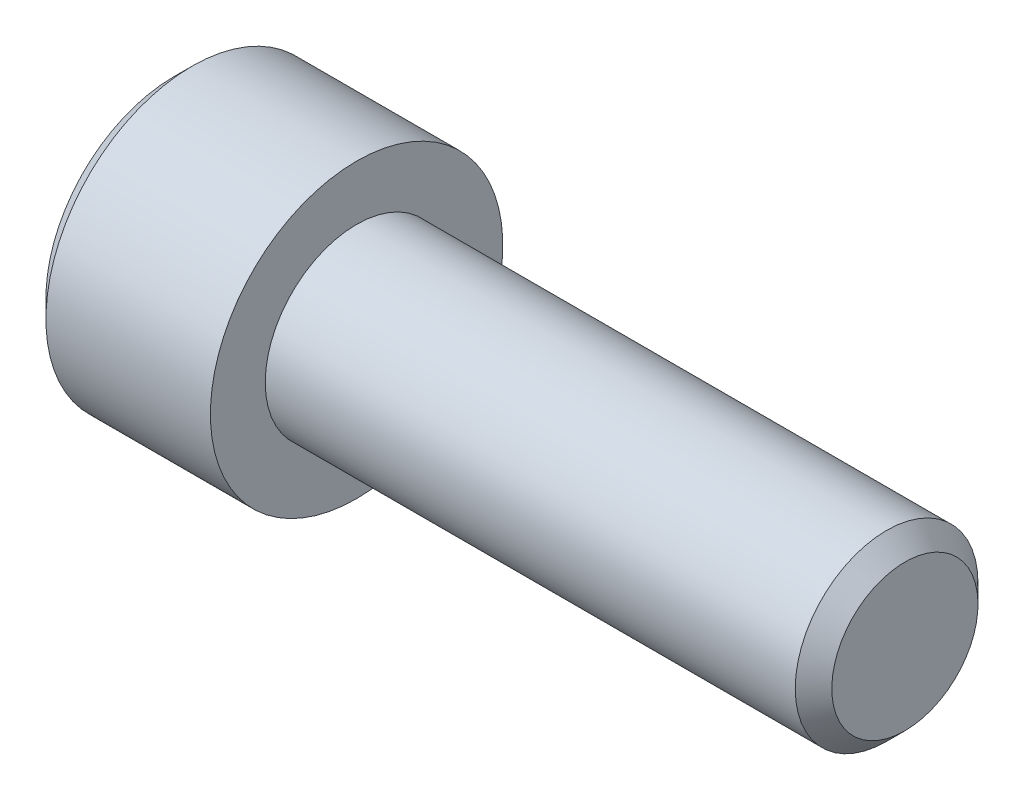
ISO-10303-21;
HEADER;
FILE_DESCRIPTION(('STEP AP214'),'2;1');
FILE_NAME('part.step','',(''),(''),'','','');
FILE_SCHEMA(('AUTOMOTIVE_DESIGN { 1 0 10303 214 1 1 1 1 }'));
ENDSEC;
DATA;
#1=APPLICATION_CONTEXT('core data for automotive mechanical design processes');
#2=APPLICATION_PROTOCOL_DEFINITION('international standard','automotive_design',2000,#1);
#3=PRODUCT_CONTEXT('',#1,'mechanical');
#4=PRODUCT('Part','Part','',(#3));
#5=PRODUCT_RELATED_PRODUCT_CATEGORY('part','',(#4));
#6=PRODUCT_DEFINITION_FORMATION('','',#4);
#7=PRODUCT_DEFINITION_CONTEXT('part definition',#1,'design');
#8=PRODUCT_DEFINITION('design','',#6,#7);
#9=PRODUCT_DEFINITION_SHAPE('','',#8);
#10=(LENGTH_UNIT() NAMED_UNIT(*) SI_UNIT(.MILLI.,.METRE.));
#11=(NAMED_UNIT(*) PLANE_ANGLE_UNIT() SI_UNIT($,.RADIAN.));
#12=(NAMED_UNIT(*) SI_UNIT($,.STERADIAN.) SOLID_ANGLE_UNIT());
#13=UNCERTAINTY_MEASURE_WITH_UNIT(LENGTH_MEASURE(1.E-05),#10,'distance_accuracy_value','');
#14=(GEOMETRIC_REPRESENTATION_CONTEXT(3) GLOBAL_UNCERTAINTY_ASSIGNED_CONTEXT((#13)) GLOBAL_UNIT_ASSIGNED_CONTEXT((#10,
#11,#12)) REPRESENTATION_CONTEXT('',''));
#15=CARTESIAN_POINT('',(0.,0.,0.));
#16=DIRECTION('',(0.,0.,1.));
#17=DIRECTION('',(1.,0.,0.));
#18=AXIS2_PLACEMENT_3D('',#15,#16,#17);
#19=CARTESIAN_POINT('',(-10.,0.,0.));
#20=DIRECTION('',(1.,0.,0.));
#21=DIRECTION('',(0.,1.,0.));
#22=AXIS2_PLACEMENT_3D('',#19,#20,#21);
#23=PLANE('',#22);
#24=CARTESIAN_POINT('',(-10.,0.,0.));
#25=DIRECTION('',(1.,0.,0.));
#26=DIRECTION('',(0.,1.,0.));
#27=AXIS2_PLACEMENT_3D('',#24,#25,#26);
#28=CIRCLE('',#27,6.99999999999999);
#29=CARTESIAN_POINT('',(-10.,6.99999999999999,0.));
#30=VERTEX_POINT('',#29);
#31=EDGE_CURVE('E42',#30,#30,#28,.F.);
#32=ORIENTED_EDGE('',*,*,#31,.T.);
#33=EDGE_LOOP('',(#32));
#34=FACE_BOUND('',#33,.T.);
#35=DIRECTION('',(0.,0.5,0.866025403784439));
#36=VECTOR('',#35,1.);
#37=CARTESIAN_POINT('',(-10.,2.30940107675851,-4.));
#38=LINE('',#37,#36);
#39=CARTESIAN_POINT('',(-10.,2.30940107675851,-4.));
#40=VERTEX_POINT('',#39);
#41=CARTESIAN_POINT('',(-10.,4.61880215351701,0.));
#42=VERTEX_POINT('',#41);
#43=EDGE_CURVE('E49',#40,#42,#38,.T.);
#44=ORIENTED_EDGE('',*,*,#43,.T.);
#45=DIRECTION('',(0.,-0.5,0.866025403784438));
#46=VECTOR('',#45,1.);
#47=CARTESIAN_POINT('',(-10.,4.61880215351701,0.));
#48=LINE('',#47,#46);
#49=CARTESIAN_POINT('',(-10.,2.3094010767585,4.));
#50=VERTEX_POINT('',#49);
#51=EDGE_CURVE('E107',#42,#50,#48,.T.);
#52=ORIENTED_EDGE('',*,*,#51,.T.);
#53=DIRECTION('',(0.,-1.,0.));
#54=VECTOR('',#53,1.);
#55=CARTESIAN_POINT('',(-10.,2.3094010767585,4.));
#56=LINE('',#55,#54);
#57=CARTESIAN_POINT('',(-10.,-2.3094010767585,4.));
#58=VERTEX_POINT('',#57);
#59=EDGE_CURVE('E291',#50,#58,#56,.T.);
#60=ORIENTED_EDGE('',*,*,#59,.T.);
#61=DIRECTION('',(0.,-0.5,-0.866025403784439));
#62=VECTOR('',#61,1.);
#63=CARTESIAN_POINT('',(-10.,-2.3094010767585,4.));
#64=LINE('',#63,#62);
#65=CARTESIAN_POINT('',(-10.,-4.61880215351701,0.));
#66=VERTEX_POINT('',#65);
#67=EDGE_CURVE('E288',#58,#66,#64,.T.);
#68=ORIENTED_EDGE('',*,*,#67,.T.);
#69=DIRECTION('',(0.,0.5,-0.866025403784439));
#70=VECTOR('',#69,1.);
#71=CARTESIAN_POINT('',(-10.,-4.61880215351701,0.));
#72=LINE('',#71,#70);
#73=CARTESIAN_POINT('',(-10.,-2.3094010767585,-4.));
#74=VERTEX_POINT('',#73);
#75=EDGE_CURVE('E282',#66,#74,#72,.T.);
#76=ORIENTED_EDGE('',*,*,#75,.T.);
#77=DIRECTION('',(0.,1.,0.));
#78=VECTOR('',#77,1.);
#79=CARTESIAN_POINT('',(-10.,-2.3094010767585,-4.));
#80=LINE('',#79,#78);
#81=EDGE_CURVE('E103',#74,#40,#80,.T.);
#82=ORIENTED_EDGE('',*,*,#81,.T.);
#83=EDGE_LOOP('',(#44,#52,#60,#68,#76,#82));
#84=FACE_BOUND('',#83,.T.);
#85=ADVANCED_FACE('F34',(#34,#84),#23,.F.);
#86=CARTESIAN_POINT('',(30.,0.,0.));
#87=DIRECTION('',(-1.,0.,0.));
#88=DIRECTION('',(0.,-1.,0.));
#89=AXIS2_PLACEMENT_3D('',#86,#87,#88);
#90=CYLINDRICAL_SURFACE('',#89,8.);
#91=CARTESIAN_POINT('',(-8.99999999999998,0.,0.));
#92=DIRECTION('',(1.,0.,0.));
#93=DIRECTION('',(0.,1.,0.));
#94=AXIS2_PLACEMENT_3D('',#91,#92,#93);
#95=CIRCLE('',#94,8.);
#96=CARTESIAN_POINT('',(-8.99999999999998,7.99999999999999,0.));
#97=VERTEX_POINT('',#96);
#98=EDGE_CURVE('E11',#97,#97,#95,.T.);
#99=ORIENTED_EDGE('',*,*,#98,.T.);
#100=EDGE_LOOP('',(#99));
#101=FACE_BOUND('',#100,.T.);
#102=CARTESIAN_POINT('',(0.,0.,0.));
#103=DIRECTION('',(-1.,0.,0.));
#104=DIRECTION('',(0.,-1.,0.));
#105=AXIS2_PLACEMENT_3D('',#102,#103,#104);
#106=CIRCLE('',#105,8.);
#107=CARTESIAN_POINT('',(0.,-8.,0.));
#108=VERTEX_POINT('',#107);
#109=EDGE_CURVE('E120',#108,#108,#106,.T.);
#110=ORIENTED_EDGE('',*,*,#109,.T.);
#111=EDGE_LOOP('',(#110));
#112=FACE_BOUND('',#111,.T.);
#113=ADVANCED_FACE('F143',(#101,#112),#90,.T.);
#114=CARTESIAN_POINT('',(0.,7.99999999999999,0.));
#115=DIRECTION('',(-1.,0.,0.));
#116=DIRECTION('',(0.,-1.,0.));
#117=AXIS2_PLACEMENT_3D('',#114,#115,#116);
#118=PLANE('',#117);
#119=ORIENTED_EDGE('',*,*,#109,.F.);
#120=EDGE_LOOP('',(#119));
#121=FACE_BOUND('',#120,.T.);
#122=CARTESIAN_POINT('',(0.,0.,0.));
#123=DIRECTION('',(-1.,0.,0.));
#124=DIRECTION('',(0.,-1.,0.));
#125=AXIS2_PLACEMENT_3D('',#122,#123,#124);
#126=CIRCLE('',#125,5.);
#127=CARTESIAN_POINT('',(0.,-5.,0.));
#128=VERTEX_POINT('',#127);
#129=EDGE_CURVE('E112',#128,#128,#126,.T.);
#130=ORIENTED_EDGE('',*,*,#129,.T.);
#131=EDGE_LOOP('',(#130));
#132=FACE_BOUND('',#131,.T.);
#133=ADVANCED_FACE('F148',(#121,#132),#118,.F.);
#134=CARTESIAN_POINT('',(30.,0.,0.));
#135=DIRECTION('',(-1.,0.,0.));
#136=DIRECTION('',(0.,-1.,0.));
#137=AXIS2_PLACEMENT_3D('',#134,#135,#136);
#138=CYLINDRICAL_SURFACE('',#137,5.);
#139=CARTESIAN_POINT('',(29.,0.,0.));
#140=DIRECTION('',(-1.,0.,0.));
#141=DIRECTION('',(0.,-1.,0.));
#142=AXIS2_PLACEMENT_3D('',#139,#140,#141);
#143=CIRCLE('',#142,5.);
#144=CARTESIAN_POINT('',(29.,-5.,0.));
#145=VERTEX_POINT('',#144);
#146=EDGE_CURVE('E123',#145,#145,#143,.T.);
#147=ORIENTED_EDGE('',*,*,#146,.T.);
#148=EDGE_LOOP('',(#147));
#149=FACE_BOUND('',#148,.T.);
#150=ORIENTED_EDGE('',*,*,#129,.F.);
#151=EDGE_LOOP('',(#150));
#152=FACE_BOUND('',#151,.T.);
#153=ADVANCED_FACE('F154',(#149,#152),#138,.T.);
#154=CARTESIAN_POINT('',(30.,4.99999999999999,0.));
#155=DIRECTION('',(-1.,0.,0.));
#156=DIRECTION('',(0.,-1.,0.));
#157=AXIS2_PLACEMENT_3D('',#154,#155,#156);
#158=PLANE('',#157);
#159=CARTESIAN_POINT('',(30.,0.,0.));
#160=DIRECTION('',(-1.,0.,0.));
#161=DIRECTION('',(0.,-1.,0.));
#162=AXIS2_PLACEMENT_3D('',#159,#160,#161);
#163=CIRCLE('',#162,3.99999999999999);
#164=CARTESIAN_POINT('',(30.,-3.99999999999999,0.));
#165=VERTEX_POINT('',#164);
#166=EDGE_CURVE('E126',#165,#165,#163,.F.);
#167=ORIENTED_EDGE('',*,*,#166,.T.);
#168=EDGE_LOOP('',(#167));
#169=FACE_BOUND('',#168,.T.);
#170=ADVANCED_FACE('F158',(#169),#158,.F.);
#171=CARTESIAN_POINT('',(-5.,2.30940107675851,-4.));
#172=DIRECTION('',(0.,-0.866025403784439,0.5));
#173=DIRECTION('',(0.,-0.5,-0.866025403784439));
#174=AXIS2_PLACEMENT_3D('',#171,#172,#173);
#175=PLANE('',#174);
#176=ORIENTED_EDGE('',*,*,#43,.F.);
#177=DIRECTION('',(-1.,0.,0.));
#178=VECTOR('',#177,1.);
#179=CARTESIAN_POINT('',(-5.,2.30940107675851,-4.));
#180=LINE('',#179,#178);
#181=CARTESIAN_POINT('',(-5.,2.30940107675851,-4.));
#182=VERTEX_POINT('',#181);
#183=EDGE_CURVE('E102',#182,#40,#180,.T.);
#184=ORIENTED_EDGE('',*,*,#183,.F.);
#185=DIRECTION('',(0.,0.5,0.866025403784439));
#186=VECTOR('',#185,1.);
#187=CARTESIAN_POINT('',(-5.,2.30940107675851,-4.));
#188=LINE('',#187,#186);
#189=CARTESIAN_POINT('',(-5.,4.61880215351701,0.));
#190=VERTEX_POINT('',#189);
#191=EDGE_CURVE('E93',#182,#190,#188,.T.);
#192=ORIENTED_EDGE('',*,*,#191,.T.);
#193=DIRECTION('',(-1.,0.,0.));
#194=VECTOR('',#193,1.);
#195=CARTESIAN_POINT('',(-5.,4.61880215351701,0.));
#196=LINE('',#195,#194);
#197=EDGE_CURVE('E101',#190,#42,#196,.T.);
#198=ORIENTED_EDGE('',*,*,#197,.T.);
#199=EDGE_LOOP('',(#176,#184,#192,#198));
#200=FACE_BOUND('',#199,.T.);
#201=ADVANCED_FACE('F100',(#200),#175,.T.);
#202=CARTESIAN_POINT('',(-5.,4.61880215351701,0.));
#203=DIRECTION('',(0.,-0.866025403784438,-0.5));
#204=DIRECTION('',(0.,0.5,-0.866025403784439));
#205=AXIS2_PLACEMENT_3D('',#202,#203,#204);
#206=PLANE('',#205);
#207=ORIENTED_EDGE('',*,*,#51,.F.);
#208=ORIENTED_EDGE('',*,*,#197,.F.);
#209=DIRECTION('',(0.,-0.5,0.866025403784438));
#210=VECTOR('',#209,1.);
#211=CARTESIAN_POINT('',(-5.,4.61880215351701,0.));
#212=LINE('',#211,#210);
#213=CARTESIAN_POINT('',(-5.,2.3094010767585,4.));
#214=VERTEX_POINT('',#213);
#215=EDGE_CURVE('E89',#190,#214,#212,.T.);
#216=ORIENTED_EDGE('',*,*,#215,.T.);
#217=DIRECTION('',(-1.,0.,0.));
#218=VECTOR('',#217,1.);
#219=CARTESIAN_POINT('',(-5.,2.3094010767585,4.));
#220=LINE('',#219,#218);
#221=EDGE_CURVE('E109',#214,#50,#220,.T.);
#222=ORIENTED_EDGE('',*,*,#221,.T.);
#223=EDGE_LOOP('',(#207,#208,#216,#222));
#224=FACE_BOUND('',#223,.T.);
#225=ADVANCED_FACE('F105',(#224),#206,.T.);
#226=CARTESIAN_POINT('',(-5.,2.3094010767585,4.));
#227=DIRECTION('',(0.,0.,-1.));
#228=DIRECTION('',(0.,1.,0.));
#229=AXIS2_PLACEMENT_3D('',#226,#227,#228);
#230=PLANE('',#229);
#231=ORIENTED_EDGE('',*,*,#59,.F.);
#232=ORIENTED_EDGE('',*,*,#221,.F.);
#233=DIRECTION('',(0.,-1.,0.));
#234=VECTOR('',#233,1.);
#235=CARTESIAN_POINT('',(-5.,2.3094010767585,4.));
#236=LINE('',#235,#234);
#237=CARTESIAN_POINT('',(-5.,-2.3094010767585,4.));
#238=VERTEX_POINT('',#237);
#239=EDGE_CURVE('E95',#214,#238,#236,.T.);
#240=ORIENTED_EDGE('',*,*,#239,.T.);
#241=DIRECTION('',(-1.,0.,0.));
#242=VECTOR('',#241,1.);
#243=CARTESIAN_POINT('',(-5.,-2.3094010767585,4.));
#244=LINE('',#243,#242);
#245=EDGE_CURVE('E114',#238,#58,#244,.T.);
#246=ORIENTED_EDGE('',*,*,#245,.T.);
#247=EDGE_LOOP('',(#231,#232,#240,#246));
#248=FACE_BOUND('',#247,.T.);
#249=ADVANCED_FACE('F170',(#248),#230,.T.);
#250=CARTESIAN_POINT('',(-5.,-2.3094010767585,4.));
#251=DIRECTION('',(0.,0.866025403784439,-0.5));
#252=DIRECTION('',(0.,0.5,0.866025403784439));
#253=AXIS2_PLACEMENT_3D('',#250,#251,#252);
#254=PLANE('',#253);
#255=ORIENTED_EDGE('',*,*,#67,.F.);
#256=ORIENTED_EDGE('',*,*,#245,.F.);
#257=DIRECTION('',(0.,-0.5,-0.866025403784439));
#258=VECTOR('',#257,1.);
#259=CARTESIAN_POINT('',(-5.,-2.3094010767585,4.));
#260=LINE('',#259,#258);
#261=CARTESIAN_POINT('',(-5.,-4.618802153517,0.));
#262=VERTEX_POINT('',#261);
#263=EDGE_CURVE('E307',#238,#262,#260,.T.);
#264=ORIENTED_EDGE('',*,*,#263,.T.);
#265=DIRECTION('',(-1.,0.,0.));
#266=VECTOR('',#265,1.);
#267=CARTESIAN_POINT('',(-5.,-4.618802153517,0.));
#268=LINE('',#267,#266);
#269=EDGE_CURVE('E298',#262,#66,#268,.T.);
#270=ORIENTED_EDGE('',*,*,#269,.T.);
#271=EDGE_LOOP('',(#255,#256,#264,#270));
#272=FACE_BOUND('',#271,.T.);
#273=ADVANCED_FACE('F173',(#272),#254,.T.);
#274=CARTESIAN_POINT('',(-5.,-4.618802153517,0.));
#275=DIRECTION('',(0.,0.866025403784439,0.5));
#276=DIRECTION('',(0.,-0.5,0.866025403784439));
#277=AXIS2_PLACEMENT_3D('',#274,#275,#276);
#278=PLANE('',#277);
#279=ORIENTED_EDGE('',*,*,#75,.F.);
#280=ORIENTED_EDGE('',*,*,#269,.F.);
#281=DIRECTION('',(0.,0.5,-0.866025403784439));
#282=VECTOR('',#281,1.);
#283=CARTESIAN_POINT('',(-5.,-4.618802153517,0.));
#284=LINE('',#283,#282);
#285=CARTESIAN_POINT('',(-5.,-2.3094010767585,-4.));
#286=VERTEX_POINT('',#285);
#287=EDGE_CURVE('E305',#262,#286,#284,.T.);
#288=ORIENTED_EDGE('',*,*,#287,.T.);
#289=DIRECTION('',(-1.,0.,0.));
#290=VECTOR('',#289,1.);
#291=CARTESIAN_POINT('',(-5.,-2.3094010767585,-4.));
#292=LINE('',#291,#290);
#293=EDGE_CURVE('E281',#286,#74,#292,.T.);
#294=ORIENTED_EDGE('',*,*,#293,.T.);
#295=EDGE_LOOP('',(#279,#280,#288,#294));
#296=FACE_BOUND('',#295,.T.);
#297=ADVANCED_FACE('F177',(#296),#278,.T.);
#298=CARTESIAN_POINT('',(-5.,-2.3094010767585,-4.));
#299=DIRECTION('',(0.,0.,1.));
#300=DIRECTION('',(0.,-1.,0.));
#301=AXIS2_PLACEMENT_3D('',#298,#299,#300);
#302=PLANE('',#301);
#303=ORIENTED_EDGE('',*,*,#81,.F.);
#304=ORIENTED_EDGE('',*,*,#293,.F.);
#305=DIRECTION('',(0.,1.,0.));
#306=VECTOR('',#305,1.);
#307=CARTESIAN_POINT('',(-5.,-2.3094010767585,-4.));
#308=LINE('',#307,#306);
#309=EDGE_CURVE('E296',#286,#182,#308,.T.);
#310=ORIENTED_EDGE('',*,*,#309,.T.);
#311=ORIENTED_EDGE('',*,*,#183,.T.);
#312=EDGE_LOOP('',(#303,#304,#310,#311));
#313=FACE_BOUND('',#312,.T.);
#314=ADVANCED_FACE('F181',(#313),#302,.T.);
#315=CARTESIAN_POINT('',(-5.,4.61880215351701,0.));
#316=DIRECTION('',(1.,0.,0.));
#317=DIRECTION('',(0.,0.,-1.));
#318=AXIS2_PLACEMENT_3D('',#315,#316,#317);
#319=PLANE('',#318);
#320=CARTESIAN_POINT('',(-5.,0.,0.));
#321=DIRECTION('',(1.,0.,0.));
#322=DIRECTION('',(0.,0.,-1.));
#323=AXIS2_PLACEMENT_3D('',#320,#321,#322);
#324=CIRCLE('',#323,3.995);
#325=CARTESIAN_POINT('',(-5.,0.,-3.995));
#326=VERTEX_POINT('',#325);
#327=EDGE_CURVE('E108',#326,#326,#324,.T.);
#328=ORIENTED_EDGE('',*,*,#327,.T.);
#329=EDGE_LOOP('',(#328));
#330=FACE_BOUND('',#329,.T.);
#331=ORIENTED_EDGE('',*,*,#191,.F.);
#332=ORIENTED_EDGE('',*,*,#309,.F.);
#333=ORIENTED_EDGE('',*,*,#287,.F.);
#334=ORIENTED_EDGE('',*,*,#263,.F.);
#335=ORIENTED_EDGE('',*,*,#239,.F.);
#336=ORIENTED_EDGE('',*,*,#215,.F.);
#337=EDGE_LOOP('',(#331,#332,#333,#334,#335,#336));
#338=FACE_BOUND('',#337,.T.);
#339=ADVANCED_FACE('F91',(#330,#338),#319,.F.);
#340=CARTESIAN_POINT('',(-3.92954297623768,0.,0.));
#341=DIRECTION('',(-1.,0.,0.));
#342=DIRECTION('',(0.,-1.,0.));
#343=AXIS2_PLACEMENT_3D('',#340,#341,#342);
#344=CONICAL_SURFACE('',#343,0.,1.30899693899575);
#345=ORIENTED_EDGE('',*,*,#327,.F.);
#346=EDGE_LOOP('',(#345));
#347=FACE_BOUND('',#346,.T.);
#348=CARTESIAN_POINT('',(-3.92954297623768,0.,0.));
#349=VERTEX_POINT('',#348);
#350=VERTEX_LOOP('',#349);
#351=FACE_BOUND('',#350,.T.);
#352=ADVANCED_FACE('F139',(#347,#351),#344,.F.);
#353=CARTESIAN_POINT('',(29.,0.,0.));
#354=DIRECTION('',(-1.,0.,0.));
#355=DIRECTION('',(0.,-1.,0.));
#356=AXIS2_PLACEMENT_3D('',#353,#354,#355);
#357=CONICAL_SURFACE('',#356,5.,0.785398163397451);
#358=ORIENTED_EDGE('',*,*,#166,.F.);
#359=EDGE_LOOP('',(#358));
#360=FACE_BOUND('',#359,.T.);
#361=ORIENTED_EDGE('',*,*,#146,.F.);
#362=EDGE_LOOP('',(#361));
#363=FACE_BOUND('',#362,.T.);
#364=ADVANCED_FACE('F134',(#360,#363),#357,.T.);
#365=CARTESIAN_POINT('',(-10.,0.,0.));
#366=DIRECTION('',(1.,0.,0.));
#367=DIRECTION('',(0.,1.,0.));
#368=AXIS2_PLACEMENT_3D('',#365,#366,#367);
#369=CONICAL_SURFACE('',#368,6.99999999999999,0.785398163397443);
#370=ORIENTED_EDGE('',*,*,#98,.F.);
#371=EDGE_LOOP('',(#370));
#372=FACE_BOUND('',#371,.T.);
#373=ORIENTED_EDGE('',*,*,#31,.F.);
#374=EDGE_LOOP('',(#373));
#375=FACE_BOUND('',#374,.T.);
#376=ADVANCED_FACE('F36',(#372,#375),#369,.T.);
#377=CLOSED_SHELL('',(#85,#113,#133,#153,#170,#201,#225,#249,#273,#297,#314,#339,#352,#364,#376));
#378=MANIFOLD_SOLID_BREP('B2',#377);
#379=ADVANCED_BREP_SHAPE_REPRESENTATION('',(#18,#378),#14);
#380=SHAPE_DEFINITION_REPRESENTATION(#9,#379);
ENDSEC;
END-ISO-10303-21;
